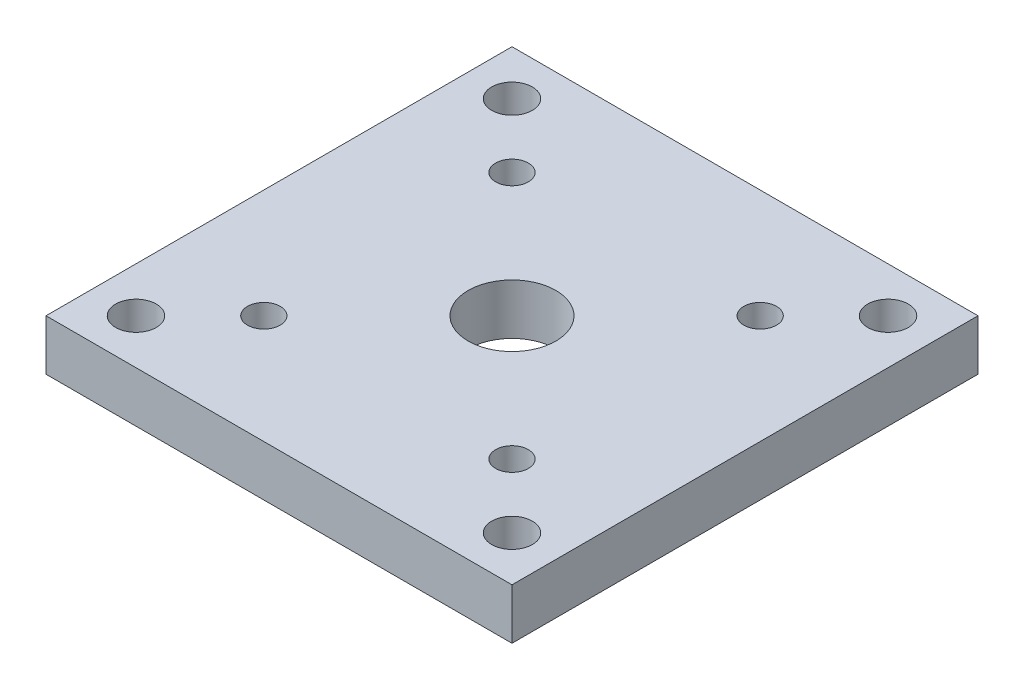
ISO-10303-21;
HEADER;
FILE_DESCRIPTION(('STEP AP214'),'2;1');
FILE_NAME('part.step','',(''),(''),'','','');
FILE_SCHEMA(('AUTOMOTIVE_DESIGN { 1 0 10303 214 1 1 1 1 }'));
ENDSEC;
DATA;
#1=APPLICATION_CONTEXT('core data for automotive mechanical design processes');
#2=APPLICATION_PROTOCOL_DEFINITION('international standard','automotive_design',2000,#1);
#3=PRODUCT_CONTEXT('',#1,'mechanical');
#4=PRODUCT('Part','Part','',(#3));
#5=PRODUCT_RELATED_PRODUCT_CATEGORY('part','',(#4));
#6=PRODUCT_DEFINITION_FORMATION('','',#4);
#7=PRODUCT_DEFINITION_CONTEXT('part definition',#1,'design');
#8=PRODUCT_DEFINITION('design','',#6,#7);
#9=PRODUCT_DEFINITION_SHAPE('','',#8);
#10=(LENGTH_UNIT() NAMED_UNIT(*) SI_UNIT(.MILLI.,.METRE.));
#11=(NAMED_UNIT(*) PLANE_ANGLE_UNIT() SI_UNIT($,.RADIAN.));
#12=(NAMED_UNIT(*) SI_UNIT($,.STERADIAN.) SOLID_ANGLE_UNIT());
#13=UNCERTAINTY_MEASURE_WITH_UNIT(LENGTH_MEASURE(1.E-05),#10,'distance_accuracy_value','');
#14=(GEOMETRIC_REPRESENTATION_CONTEXT(3) GLOBAL_UNCERTAINTY_ASSIGNED_CONTEXT((#13)) GLOBAL_UNIT_ASSIGNED_CONTEXT((#10,
#11,#12)) REPRESENTATION_CONTEXT('',''));
#15=CARTESIAN_POINT('',(0.,0.,0.));
#16=DIRECTION('',(0.,0.,1.));
#17=DIRECTION('',(1.,0.,0.));
#18=AXIS2_PLACEMENT_3D('',#15,#16,#17);
#19=CARTESIAN_POINT('',(0.,6.35,0.));
#20=DIRECTION('',(0.,-1.,0.));
#21=DIRECTION('',(0.,0.,-1.));
#22=AXIS2_PLACEMENT_3D('',#19,#20,#21);
#23=PLANE('',#22);
#24=DIRECTION('',(0.,0.,1.));
#25=VECTOR('',#24,1.);
#26=CARTESIAN_POINT('',(0.,6.35,0.));
#27=LINE('',#26,#25);
#28=CARTESIAN_POINT('',(0.,6.35,-58.42));
#29=VERTEX_POINT('',#28);
#30=CARTESIAN_POINT('',(0.,6.35,0.));
#31=VERTEX_POINT('',#30);
#32=EDGE_CURVE('E85',#29,#31,#27,.T.);
#33=ORIENTED_EDGE('',*,*,#32,.T.);
#34=DIRECTION('',(1.,0.,0.));
#35=VECTOR('',#34,1.);
#36=CARTESIAN_POINT('',(0.,6.35,0.));
#37=LINE('',#36,#35);
#38=CARTESIAN_POINT('',(58.42,6.35,0.));
#39=VERTEX_POINT('',#38);
#40=EDGE_CURVE('E80',#31,#39,#37,.T.);
#41=ORIENTED_EDGE('',*,*,#40,.T.);
#42=DIRECTION('',(0.,0.,-1.));
#43=VECTOR('',#42,1.);
#44=CARTESIAN_POINT('',(58.42,6.35,0.));
#45=LINE('',#44,#43);
#46=CARTESIAN_POINT('',(58.42,6.35,-58.42));
#47=VERTEX_POINT('',#46);
#48=EDGE_CURVE('E83',#39,#47,#45,.T.);
#49=ORIENTED_EDGE('',*,*,#48,.T.);
#50=DIRECTION('',(-1.,0.,0.));
#51=VECTOR('',#50,1.);
#52=CARTESIAN_POINT('',(0.,6.35,-58.42));
#53=LINE('',#52,#51);
#54=EDGE_CURVE('E49',#47,#29,#53,.T.);
#55=ORIENTED_EDGE('',*,*,#54,.T.);
#56=EDGE_LOOP('',(#33,#41,#49,#55));
#57=FACE_BOUND('',#56,.T.);
#58=CARTESIAN_POINT('',(5.63999999999999,6.35,-52.78));
#59=DIRECTION('',(0.,1.,0.));
#60=DIRECTION('',(0.,0.,1.));
#61=AXIS2_PLACEMENT_3D('',#58,#59,#60);
#62=CIRCLE('',#61,2.55);
#63=CARTESIAN_POINT('',(5.63999999999999,6.35,-50.23));
#64=VERTEX_POINT('',#63);
#65=EDGE_CURVE('E103',#64,#64,#62,.T.);
#66=ORIENTED_EDGE('',*,*,#65,.F.);
#67=EDGE_LOOP('',(#66));
#68=FACE_BOUND('',#67,.T.);
#69=CARTESIAN_POINT('',(52.78,6.35,-52.78));
#70=DIRECTION('',(0.,1.,0.));
#71=DIRECTION('',(0.,0.,1.));
#72=AXIS2_PLACEMENT_3D('',#69,#70,#71);
#73=CIRCLE('',#72,2.55);
#74=CARTESIAN_POINT('',(52.78,6.35,-50.23));
#75=VERTEX_POINT('',#74);
#76=EDGE_CURVE('E194',#75,#75,#73,.T.);
#77=ORIENTED_EDGE('',*,*,#76,.F.);
#78=EDGE_LOOP('',(#77));
#79=FACE_BOUND('',#78,.T.);
#80=CARTESIAN_POINT('',(52.78,6.35,-5.63999999999999));
#81=DIRECTION('',(0.,1.,0.));
#82=DIRECTION('',(0.,0.,1.));
#83=AXIS2_PLACEMENT_3D('',#80,#81,#82);
#84=CIRCLE('',#83,2.55);
#85=CARTESIAN_POINT('',(52.78,6.35,-3.08999999999999));
#86=VERTEX_POINT('',#85);
#87=EDGE_CURVE('E190',#86,#86,#84,.T.);
#88=ORIENTED_EDGE('',*,*,#87,.F.);
#89=EDGE_LOOP('',(#88));
#90=FACE_BOUND('',#89,.T.);
#91=CARTESIAN_POINT('',(5.63999999999999,6.35,-5.63999999999999));
#92=DIRECTION('',(0.,1.,0.));
#93=DIRECTION('',(0.,0.,1.));
#94=AXIS2_PLACEMENT_3D('',#91,#92,#93);
#95=CIRCLE('',#94,2.55);
#96=CARTESIAN_POINT('',(5.63999999999999,6.35,-3.08999999999999));
#97=VERTEX_POINT('',#96);
#98=EDGE_CURVE('E186',#97,#97,#95,.T.);
#99=ORIENTED_EDGE('',*,*,#98,.F.);
#100=EDGE_LOOP('',(#99));
#101=FACE_BOUND('',#100,.T.);
#102=CARTESIAN_POINT('',(13.6536508138959,6.35,-44.766349186104));
#103=DIRECTION('',(0.,1.,0.));
#104=DIRECTION('',(0.,0.,1.));
#105=AXIS2_PLACEMENT_3D('',#102,#103,#104);
#106=CIRCLE('',#105,2.05);
#107=CARTESIAN_POINT('',(13.6536508138959,6.35,-42.716349186104));
#108=VERTEX_POINT('',#107);
#109=EDGE_CURVE('E183',#108,#108,#106,.T.);
#110=ORIENTED_EDGE('',*,*,#109,.F.);
#111=EDGE_LOOP('',(#110));
#112=FACE_BOUND('',#111,.T.);
#113=CARTESIAN_POINT('',(44.766349186104,6.35,-44.766349186104));
#114=DIRECTION('',(0.,1.,0.));
#115=DIRECTION('',(0.,0.,1.));
#116=AXIS2_PLACEMENT_3D('',#113,#114,#115);
#117=CIRCLE('',#116,2.05);
#118=CARTESIAN_POINT('',(44.766349186104,6.35,-42.716349186104));
#119=VERTEX_POINT('',#118);
#120=EDGE_CURVE('E180',#119,#119,#117,.T.);
#121=ORIENTED_EDGE('',*,*,#120,.F.);
#122=EDGE_LOOP('',(#121));
#123=FACE_BOUND('',#122,.T.);
#124=CARTESIAN_POINT('',(44.766349186104,6.35,-13.6536508138959));
#125=DIRECTION('',(0.,1.,0.));
#126=DIRECTION('',(0.,0.,1.));
#127=AXIS2_PLACEMENT_3D('',#124,#125,#126);
#128=CIRCLE('',#127,2.04999999999999);
#129=CARTESIAN_POINT('',(44.766349186104,6.35,-11.603650813896));
#130=VERTEX_POINT('',#129);
#131=EDGE_CURVE('E177',#130,#130,#128,.T.);
#132=ORIENTED_EDGE('',*,*,#131,.F.);
#133=EDGE_LOOP('',(#132));
#134=FACE_BOUND('',#133,.T.);
#135=CARTESIAN_POINT('',(13.6536508138959,6.35,-13.6536508138959));
#136=DIRECTION('',(0.,1.,0.));
#137=DIRECTION('',(0.,0.,1.));
#138=AXIS2_PLACEMENT_3D('',#135,#136,#137);
#139=CIRCLE('',#138,2.05);
#140=CARTESIAN_POINT('',(13.6536508138959,6.35,-11.6036508138959));
#141=VERTEX_POINT('',#140);
#142=EDGE_CURVE('E172',#141,#141,#139,.T.);
#143=ORIENTED_EDGE('',*,*,#142,.F.);
#144=EDGE_LOOP('',(#143));
#145=FACE_BOUND('',#144,.T.);
#146=CARTESIAN_POINT('',(29.21,6.35,-29.21));
#147=DIRECTION('',(0.,1.,0.));
#148=DIRECTION('',(0.,0.,1.));
#149=AXIS2_PLACEMENT_3D('',#146,#147,#148);
#150=CIRCLE('',#149,5.5);
#151=CARTESIAN_POINT('',(29.21,6.35,-23.71));
#152=VERTEX_POINT('',#151);
#153=EDGE_CURVE('E169',#152,#152,#150,.T.);
#154=ORIENTED_EDGE('',*,*,#153,.F.);
#155=EDGE_LOOP('',(#154));
#156=FACE_BOUND('',#155,.T.);
#157=ADVANCED_FACE('F32',(#57,#68,#79,#90,#101,#112,#123,#134,#145,#156),#23,.F.);
#158=CARTESIAN_POINT('',(0.,0.,0.));
#159=DIRECTION('',(0.,-1.,0.));
#160=DIRECTION('',(0.,0.,-1.));
#161=AXIS2_PLACEMENT_3D('',#158,#159,#160);
#162=PLANE('',#161);
#163=CARTESIAN_POINT('',(13.6536508138959,0.,-44.766349186104));
#164=DIRECTION('',(0.,-1.,0.));
#165=DIRECTION('',(0.,0.,-1.));
#166=AXIS2_PLACEMENT_3D('',#163,#164,#165);
#167=CIRCLE('',#166,4.53000000000001);
#168=CARTESIAN_POINT('',(13.6536508138959,0.,-49.296349186104));
#169=VERTEX_POINT('',#168);
#170=EDGE_CURVE('E119',#169,#169,#167,.F.);
#171=ORIENTED_EDGE('',*,*,#170,.T.);
#172=EDGE_LOOP('',(#171));
#173=FACE_BOUND('',#172,.T.);
#174=CARTESIAN_POINT('',(44.766349186104,0.,-44.766349186104));
#175=DIRECTION('',(0.,-1.,0.));
#176=DIRECTION('',(0.,0.,-1.));
#177=AXIS2_PLACEMENT_3D('',#174,#175,#176);
#178=CIRCLE('',#177,4.53000000000001);
#179=CARTESIAN_POINT('',(44.766349186104,0.,-49.296349186104));
#180=VERTEX_POINT('',#179);
#181=EDGE_CURVE('E116',#180,#180,#178,.F.);
#182=ORIENTED_EDGE('',*,*,#181,.T.);
#183=EDGE_LOOP('',(#182));
#184=FACE_BOUND('',#183,.T.);
#185=CARTESIAN_POINT('',(44.766349186104,0.,-13.6536508138959));
#186=DIRECTION('',(0.,-1.,0.));
#187=DIRECTION('',(0.,0.,-1.));
#188=AXIS2_PLACEMENT_3D('',#185,#186,#187);
#189=CIRCLE('',#188,4.52999999999999);
#190=CARTESIAN_POINT('',(44.766349186104,0.,-18.1836508138959));
#191=VERTEX_POINT('',#190);
#192=EDGE_CURVE('E113',#191,#191,#189,.F.);
#193=ORIENTED_EDGE('',*,*,#192,.T.);
#194=EDGE_LOOP('',(#193));
#195=FACE_BOUND('',#194,.T.);
#196=CARTESIAN_POINT('',(13.6536508138959,0.,-13.6536508138959));
#197=DIRECTION('',(0.,-1.,0.));
#198=DIRECTION('',(0.,0.,-1.));
#199=AXIS2_PLACEMENT_3D('',#196,#197,#198);
#200=CIRCLE('',#199,4.53000000000001);
#201=CARTESIAN_POINT('',(13.6536508138959,0.,-18.183650813896));
#202=VERTEX_POINT('',#201);
#203=EDGE_CURVE('E110',#202,#202,#200,.F.);
#204=ORIENTED_EDGE('',*,*,#203,.T.);
#205=EDGE_LOOP('',(#204));
#206=FACE_BOUND('',#205,.T.);
#207=CARTESIAN_POINT('',(5.63999999999999,0.,-5.63999999999999));
#208=DIRECTION('',(0.,1.,0.));
#209=DIRECTION('',(0.,0.,1.));
#210=AXIS2_PLACEMENT_3D('',#207,#208,#209);
#211=CIRCLE('',#210,2.55);
#212=CARTESIAN_POINT('',(5.63999999999999,0.,-3.08999999999999));
#213=VERTEX_POINT('',#212);
#214=EDGE_CURVE('E150',#213,#213,#211,.T.);
#215=ORIENTED_EDGE('',*,*,#214,.T.);
#216=EDGE_LOOP('',(#215));
#217=FACE_BOUND('',#216,.T.);
#218=CARTESIAN_POINT('',(52.78,0.,-52.78));
#219=DIRECTION('',(0.,1.,0.));
#220=DIRECTION('',(0.,0.,1.));
#221=AXIS2_PLACEMENT_3D('',#218,#219,#220);
#222=CIRCLE('',#221,2.55);
#223=CARTESIAN_POINT('',(52.78,0.,-50.23));
#224=VERTEX_POINT('',#223);
#225=EDGE_CURVE('E154',#224,#224,#222,.T.);
#226=ORIENTED_EDGE('',*,*,#225,.T.);
#227=EDGE_LOOP('',(#226));
#228=FACE_BOUND('',#227,.T.);
#229=DIRECTION('',(0.,0.,1.));
#230=VECTOR('',#229,1.);
#231=CARTESIAN_POINT('',(0.,0.,0.));
#232=LINE('',#231,#230);
#233=CARTESIAN_POINT('',(0.,0.,-58.42));
#234=VERTEX_POINT('',#233);
#235=CARTESIAN_POINT('',(0.,0.,0.));
#236=VERTEX_POINT('',#235);
#237=EDGE_CURVE('E100',#234,#236,#232,.T.);
#238=ORIENTED_EDGE('',*,*,#237,.F.);
#239=DIRECTION('',(-1.,0.,0.));
#240=VECTOR('',#239,1.);
#241=CARTESIAN_POINT('',(0.,0.,-58.42));
#242=LINE('',#241,#240);
#243=CARTESIAN_POINT('',(58.42,0.,-58.42));
#244=VERTEX_POINT('',#243);
#245=EDGE_CURVE('E72',#244,#234,#242,.T.);
#246=ORIENTED_EDGE('',*,*,#245,.F.);
#247=DIRECTION('',(0.,0.,-1.));
#248=VECTOR('',#247,1.);
#249=CARTESIAN_POINT('',(58.42,0.,0.));
#250=LINE('',#249,#248);
#251=CARTESIAN_POINT('',(58.42,0.,0.));
#252=VERTEX_POINT('',#251);
#253=EDGE_CURVE('E66',#252,#244,#250,.T.);
#254=ORIENTED_EDGE('',*,*,#253,.F.);
#255=DIRECTION('',(1.,0.,0.));
#256=VECTOR('',#255,1.);
#257=CARTESIAN_POINT('',(0.,0.,0.));
#258=LINE('',#257,#256);
#259=EDGE_CURVE('E90',#236,#252,#258,.T.);
#260=ORIENTED_EDGE('',*,*,#259,.F.);
#261=EDGE_LOOP('',(#238,#246,#254,#260));
#262=FACE_BOUND('',#261,.T.);
#263=CARTESIAN_POINT('',(5.63999999999999,0.,-52.78));
#264=DIRECTION('',(0.,1.,0.));
#265=DIRECTION('',(0.,0.,1.));
#266=AXIS2_PLACEMENT_3D('',#263,#264,#265);
#267=CIRCLE('',#266,2.55);
#268=CARTESIAN_POINT('',(5.63999999999999,0.,-50.23));
#269=VERTEX_POINT('',#268);
#270=EDGE_CURVE('E160',#269,#269,#267,.T.);
#271=ORIENTED_EDGE('',*,*,#270,.T.);
#272=EDGE_LOOP('',(#271));
#273=FACE_BOUND('',#272,.T.);
#274=CARTESIAN_POINT('',(52.78,0.,-5.63999999999999));
#275=DIRECTION('',(0.,1.,0.));
#276=DIRECTION('',(0.,0.,1.));
#277=AXIS2_PLACEMENT_3D('',#274,#275,#276);
#278=CIRCLE('',#277,2.55);
#279=CARTESIAN_POINT('',(52.78,0.,-3.08999999999999));
#280=VERTEX_POINT('',#279);
#281=EDGE_CURVE('E164',#280,#280,#278,.T.);
#282=ORIENTED_EDGE('',*,*,#281,.T.);
#283=EDGE_LOOP('',(#282));
#284=FACE_BOUND('',#283,.T.);
#285=CARTESIAN_POINT('',(29.21,0.,-29.21));
#286=DIRECTION('',(0.,1.,0.));
#287=DIRECTION('',(0.,0.,1.));
#288=AXIS2_PLACEMENT_3D('',#285,#286,#287);
#289=CIRCLE('',#288,5.5);
#290=CARTESIAN_POINT('',(29.21,0.,-23.71));
#291=VERTEX_POINT('',#290);
#292=EDGE_CURVE('E167',#291,#291,#289,.T.);
#293=ORIENTED_EDGE('',*,*,#292,.T.);
#294=EDGE_LOOP('',(#293));
#295=FACE_BOUND('',#294,.T.);
#296=ADVANCED_FACE('F139',(#173,#184,#195,#206,#217,#228,#262,#273,#284,#295),#162,.T.);
#297=CARTESIAN_POINT('',(0.,6.35,0.));
#298=DIRECTION('',(1.,0.,0.));
#299=DIRECTION('',(0.,0.,-1.));
#300=AXIS2_PLACEMENT_3D('',#297,#298,#299);
#301=PLANE('',#300);
#302=ORIENTED_EDGE('',*,*,#237,.T.);
#303=DIRECTION('',(0.,-1.,0.));
#304=VECTOR('',#303,1.);
#305=CARTESIAN_POINT('',(0.,6.35,0.));
#306=LINE('',#305,#304);
#307=EDGE_CURVE('E91',#31,#236,#306,.T.);
#308=ORIENTED_EDGE('',*,*,#307,.F.);
#309=ORIENTED_EDGE('',*,*,#32,.F.);
#310=DIRECTION('',(0.,-1.,0.));
#311=VECTOR('',#310,1.);
#312=CARTESIAN_POINT('',(0.,6.35,-58.42));
#313=LINE('',#312,#311);
#314=EDGE_CURVE('E96',#29,#234,#313,.T.);
#315=ORIENTED_EDGE('',*,*,#314,.T.);
#316=EDGE_LOOP('',(#302,#308,#309,#315));
#317=FACE_BOUND('',#316,.T.);
#318=ADVANCED_FACE('F142',(#317),#301,.F.);
#319=CARTESIAN_POINT('',(0.,6.35,0.));
#320=DIRECTION('',(0.,0.,-1.));
#321=DIRECTION('',(-1.,0.,0.));
#322=AXIS2_PLACEMENT_3D('',#319,#320,#321);
#323=PLANE('',#322);
#324=ORIENTED_EDGE('',*,*,#259,.T.);
#325=DIRECTION('',(0.,-1.,0.));
#326=VECTOR('',#325,1.);
#327=CARTESIAN_POINT('',(58.42,6.35,0.));
#328=LINE('',#327,#326);
#329=EDGE_CURVE('E88',#39,#252,#328,.T.);
#330=ORIENTED_EDGE('',*,*,#329,.F.);
#331=ORIENTED_EDGE('',*,*,#40,.F.);
#332=ORIENTED_EDGE('',*,*,#307,.T.);
#333=EDGE_LOOP('',(#324,#330,#331,#332));
#334=FACE_BOUND('',#333,.T.);
#335=ADVANCED_FACE('F89',(#334),#323,.F.);
#336=CARTESIAN_POINT('',(58.42,6.35,0.));
#337=DIRECTION('',(-1.,0.,0.));
#338=DIRECTION('',(0.,0.,1.));
#339=AXIS2_PLACEMENT_3D('',#336,#337,#338);
#340=PLANE('',#339);
#341=ORIENTED_EDGE('',*,*,#253,.T.);
#342=DIRECTION('',(0.,-1.,0.));
#343=VECTOR('',#342,1.);
#344=CARTESIAN_POINT('',(58.42,6.35,-58.42));
#345=LINE('',#344,#343);
#346=EDGE_CURVE('E92',#47,#244,#345,.T.);
#347=ORIENTED_EDGE('',*,*,#346,.F.);
#348=ORIENTED_EDGE('',*,*,#48,.F.);
#349=ORIENTED_EDGE('',*,*,#329,.T.);
#350=EDGE_LOOP('',(#341,#347,#348,#349));
#351=FACE_BOUND('',#350,.T.);
#352=ADVANCED_FACE('F94',(#351),#340,.F.);
#353=CARTESIAN_POINT('',(0.,6.35,-58.42));
#354=DIRECTION('',(0.,0.,1.));
#355=DIRECTION('',(1.,0.,0.));
#356=AXIS2_PLACEMENT_3D('',#353,#354,#355);
#357=PLANE('',#356);
#358=ORIENTED_EDGE('',*,*,#245,.T.);
#359=ORIENTED_EDGE('',*,*,#314,.F.);
#360=ORIENTED_EDGE('',*,*,#54,.F.);
#361=ORIENTED_EDGE('',*,*,#346,.T.);
#362=EDGE_LOOP('',(#358,#359,#360,#361));
#363=FACE_BOUND('',#362,.T.);
#364=ADVANCED_FACE('F261',(#363),#357,.F.);
#365=CARTESIAN_POINT('',(5.63999999999999,6.35,-52.78));
#366=DIRECTION('',(0.,-1.,0.));
#367=DIRECTION('',(0.,0.,-1.));
#368=AXIS2_PLACEMENT_3D('',#365,#366,#367);
#369=CYLINDRICAL_SURFACE('',#368,2.55);
#370=ORIENTED_EDGE('',*,*,#65,.T.);
#371=EDGE_LOOP('',(#370));
#372=FACE_BOUND('',#371,.T.);
#373=ORIENTED_EDGE('',*,*,#270,.F.);
#374=EDGE_LOOP('',(#373));
#375=FACE_BOUND('',#374,.T.);
#376=ADVANCED_FACE('F202',(#372,#375),#369,.F.);
#377=CARTESIAN_POINT('',(52.78,6.35,-52.78));
#378=DIRECTION('',(0.,-1.,0.));
#379=DIRECTION('',(0.,0.,-1.));
#380=AXIS2_PLACEMENT_3D('',#377,#378,#379);
#381=CYLINDRICAL_SURFACE('',#380,2.55);
#382=ORIENTED_EDGE('',*,*,#76,.T.);
#383=EDGE_LOOP('',(#382));
#384=FACE_BOUND('',#383,.T.);
#385=ORIENTED_EDGE('',*,*,#225,.F.);
#386=EDGE_LOOP('',(#385));
#387=FACE_BOUND('',#386,.T.);
#388=ADVANCED_FACE('F255',(#384,#387),#381,.F.);
#389=CARTESIAN_POINT('',(52.78,6.35,-5.63999999999999));
#390=DIRECTION('',(0.,-1.,0.));
#391=DIRECTION('',(0.,0.,-1.));
#392=AXIS2_PLACEMENT_3D('',#389,#390,#391);
#393=CYLINDRICAL_SURFACE('',#392,2.55);
#394=ORIENTED_EDGE('',*,*,#87,.T.);
#395=EDGE_LOOP('',(#394));
#396=FACE_BOUND('',#395,.T.);
#397=ORIENTED_EDGE('',*,*,#281,.F.);
#398=EDGE_LOOP('',(#397));
#399=FACE_BOUND('',#398,.T.);
#400=ADVANCED_FACE('F251',(#396,#399),#393,.F.);
#401=CARTESIAN_POINT('',(5.63999999999999,6.35,-5.63999999999999));
#402=DIRECTION('',(0.,-1.,0.));
#403=DIRECTION('',(0.,0.,-1.));
#404=AXIS2_PLACEMENT_3D('',#401,#402,#403);
#405=CYLINDRICAL_SURFACE('',#404,2.55);
#406=ORIENTED_EDGE('',*,*,#98,.T.);
#407=EDGE_LOOP('',(#406));
#408=FACE_BOUND('',#407,.T.);
#409=ORIENTED_EDGE('',*,*,#214,.F.);
#410=EDGE_LOOP('',(#409));
#411=FACE_BOUND('',#410,.T.);
#412=ADVANCED_FACE('F247',(#408,#411),#405,.F.);
#413=CARTESIAN_POINT('',(13.6536508138959,6.35,-44.766349186104));
#414=DIRECTION('',(0.,-1.,0.));
#415=DIRECTION('',(0.,0.,-1.));
#416=AXIS2_PLACEMENT_3D('',#413,#414,#415);
#417=CYLINDRICAL_SURFACE('',#416,2.05);
#418=CARTESIAN_POINT('',(13.6536508138959,2.48000000000001,-44.766349186104));
#419=DIRECTION('',(0.,-1.,0.));
#420=DIRECTION('',(0.,0.,-1.));
#421=AXIS2_PLACEMENT_3D('',#418,#419,#420);
#422=CIRCLE('',#421,2.05);
#423=CARTESIAN_POINT('',(13.6536508138959,2.48000000000001,-46.816349186104));
#424=VERTEX_POINT('',#423);
#425=EDGE_CURVE('E122',#424,#424,#422,.T.);
#426=ORIENTED_EDGE('',*,*,#425,.T.);
#427=EDGE_LOOP('',(#426));
#428=FACE_BOUND('',#427,.T.);
#429=ORIENTED_EDGE('',*,*,#109,.T.);
#430=EDGE_LOOP('',(#429));
#431=FACE_BOUND('',#430,.T.);
#432=ADVANCED_FACE('F243',(#428,#431),#417,.F.);
#433=CARTESIAN_POINT('',(44.766349186104,6.35,-44.766349186104));
#434=DIRECTION('',(0.,-1.,0.));
#435=DIRECTION('',(0.,0.,-1.));
#436=AXIS2_PLACEMENT_3D('',#433,#434,#435);
#437=CYLINDRICAL_SURFACE('',#436,2.05);
#438=CARTESIAN_POINT('',(44.766349186104,2.48000000000001,-44.766349186104));
#439=DIRECTION('',(0.,-1.,0.));
#440=DIRECTION('',(0.,0.,-1.));
#441=AXIS2_PLACEMENT_3D('',#438,#439,#440);
#442=CIRCLE('',#441,2.05);
#443=CARTESIAN_POINT('',(44.766349186104,2.48000000000001,-46.816349186104));
#444=VERTEX_POINT('',#443);
#445=EDGE_CURVE('E125',#444,#444,#442,.T.);
#446=ORIENTED_EDGE('',*,*,#445,.T.);
#447=EDGE_LOOP('',(#446));
#448=FACE_BOUND('',#447,.T.);
#449=ORIENTED_EDGE('',*,*,#120,.T.);
#450=EDGE_LOOP('',(#449));
#451=FACE_BOUND('',#450,.T.);
#452=ADVANCED_FACE('F240',(#448,#451),#437,.F.);
#453=CARTESIAN_POINT('',(44.766349186104,6.35,-13.6536508138959));
#454=DIRECTION('',(0.,-1.,0.));
#455=DIRECTION('',(0.,0.,-1.));
#456=AXIS2_PLACEMENT_3D('',#453,#454,#455);
#457=CYLINDRICAL_SURFACE('',#456,2.04999999999999);
#458=CARTESIAN_POINT('',(44.766349186104,2.47999999999999,-13.6536508138959));
#459=DIRECTION('',(0.,-1.,0.));
#460=DIRECTION('',(0.,0.,-1.));
#461=AXIS2_PLACEMENT_3D('',#458,#459,#460);
#462=CIRCLE('',#461,2.04999999999999);
#463=CARTESIAN_POINT('',(44.766349186104,2.47999999999999,-15.7036508138959));
#464=VERTEX_POINT('',#463);
#465=EDGE_CURVE('E41',#464,#464,#462,.T.);
#466=ORIENTED_EDGE('',*,*,#465,.T.);
#467=EDGE_LOOP('',(#466));
#468=FACE_BOUND('',#467,.T.);
#469=ORIENTED_EDGE('',*,*,#131,.T.);
#470=EDGE_LOOP('',(#469));
#471=FACE_BOUND('',#470,.T.);
#472=ADVANCED_FACE('F130',(#468,#471),#457,.F.);
#473=CARTESIAN_POINT('',(13.6536508138959,6.35,-13.6536508138959));
#474=DIRECTION('',(0.,-1.,0.));
#475=DIRECTION('',(0.,0.,-1.));
#476=AXIS2_PLACEMENT_3D('',#473,#474,#475);
#477=CYLINDRICAL_SURFACE('',#476,2.05);
#478=CARTESIAN_POINT('',(13.6536508138959,2.48000000000001,-13.6536508138959));
#479=DIRECTION('',(0.,-1.,0.));
#480=DIRECTION('',(0.,0.,-1.));
#481=AXIS2_PLACEMENT_3D('',#478,#479,#480);
#482=CIRCLE('',#481,2.05);
#483=CARTESIAN_POINT('',(13.6536508138959,2.48000000000001,-15.7036508138959));
#484=VERTEX_POINT('',#483);
#485=EDGE_CURVE('E11',#484,#484,#482,.T.);
#486=ORIENTED_EDGE('',*,*,#485,.T.);
#487=EDGE_LOOP('',(#486));
#488=FACE_BOUND('',#487,.T.);
#489=ORIENTED_EDGE('',*,*,#142,.T.);
#490=EDGE_LOOP('',(#489));
#491=FACE_BOUND('',#490,.T.);
#492=ADVANCED_FACE('F226',(#488,#491),#477,.F.);
#493=CARTESIAN_POINT('',(29.21,6.35,-29.21));
#494=DIRECTION('',(0.,-1.,0.));
#495=DIRECTION('',(0.,0.,-1.));
#496=AXIS2_PLACEMENT_3D('',#493,#494,#495);
#497=CYLINDRICAL_SURFACE('',#496,5.5);
#498=ORIENTED_EDGE('',*,*,#153,.T.);
#499=EDGE_LOOP('',(#498));
#500=FACE_BOUND('',#499,.T.);
#501=ORIENTED_EDGE('',*,*,#292,.F.);
#502=EDGE_LOOP('',(#501));
#503=FACE_BOUND('',#502,.T.);
#504=ADVANCED_FACE('F223',(#500,#503),#497,.F.);
#505=CARTESIAN_POINT('',(13.6536508138959,0.,-44.766349186104));
#506=DIRECTION('',(0.,-1.,0.));
#507=DIRECTION('',(0.,0.,-1.));
#508=AXIS2_PLACEMENT_3D('',#505,#506,#507);
#509=CONICAL_SURFACE('',#508,4.53000000000001,0.785398163397448);
#510=ORIENTED_EDGE('',*,*,#425,.F.);
#511=EDGE_LOOP('',(#510));
#512=FACE_BOUND('',#511,.T.);
#513=ORIENTED_EDGE('',*,*,#170,.F.);
#514=EDGE_LOOP('',(#513));
#515=FACE_BOUND('',#514,.T.);
#516=ADVANCED_FACE('F225',(#512,#515),#509,.F.);
#517=CARTESIAN_POINT('',(44.766349186104,0.,-44.766349186104));
#518=DIRECTION('',(0.,-1.,0.));
#519=DIRECTION('',(0.,0.,-1.));
#520=AXIS2_PLACEMENT_3D('',#517,#518,#519);
#521=CONICAL_SURFACE('',#520,4.53000000000001,0.785398163397448);
#522=ORIENTED_EDGE('',*,*,#445,.F.);
#523=EDGE_LOOP('',(#522));
#524=FACE_BOUND('',#523,.T.);
#525=ORIENTED_EDGE('',*,*,#181,.F.);
#526=EDGE_LOOP('',(#525));
#527=FACE_BOUND('',#526,.T.);
#528=ADVANCED_FACE('F136',(#524,#527),#521,.F.);
#529=CARTESIAN_POINT('',(44.766349186104,0.,-13.6536508138959));
#530=DIRECTION('',(0.,-1.,0.));
#531=DIRECTION('',(0.,0.,-1.));
#532=AXIS2_PLACEMENT_3D('',#529,#530,#531);
#533=CONICAL_SURFACE('',#532,4.52999999999999,0.785398163397448);
#534=ORIENTED_EDGE('',*,*,#465,.F.);
#535=EDGE_LOOP('',(#534));
#536=FACE_BOUND('',#535,.T.);
#537=ORIENTED_EDGE('',*,*,#192,.F.);
#538=EDGE_LOOP('',(#537));
#539=FACE_BOUND('',#538,.T.);
#540=ADVANCED_FACE('F133',(#536,#539),#533,.F.);
#541=CARTESIAN_POINT('',(13.6536508138959,0.,-13.6536508138959));
#542=DIRECTION('',(0.,-1.,0.));
#543=DIRECTION('',(0.,0.,-1.));
#544=AXIS2_PLACEMENT_3D('',#541,#542,#543);
#545=CONICAL_SURFACE('',#544,4.53000000000001,0.785398163397448);
#546=ORIENTED_EDGE('',*,*,#485,.F.);
#547=EDGE_LOOP('',(#546));
#548=FACE_BOUND('',#547,.T.);
#549=ORIENTED_EDGE('',*,*,#203,.F.);
#550=EDGE_LOOP('',(#549));
#551=FACE_BOUND('',#550,.T.);
#552=ADVANCED_FACE('F34',(#548,#551),#545,.F.);
#553=CLOSED_SHELL('',(#157,#296,#318,#335,#352,#364,#376,#388,#400,#412,#432,#452,#472,#492,
#504,#516,#528,#540,#552));
#554=MANIFOLD_SOLID_BREP('B2',#553);
#555=ADVANCED_BREP_SHAPE_REPRESENTATION('',(#18,#554),#14);
#556=SHAPE_DEFINITION_REPRESENTATION(#9,#555);
ENDSEC;
END-ISO-10303-21;
